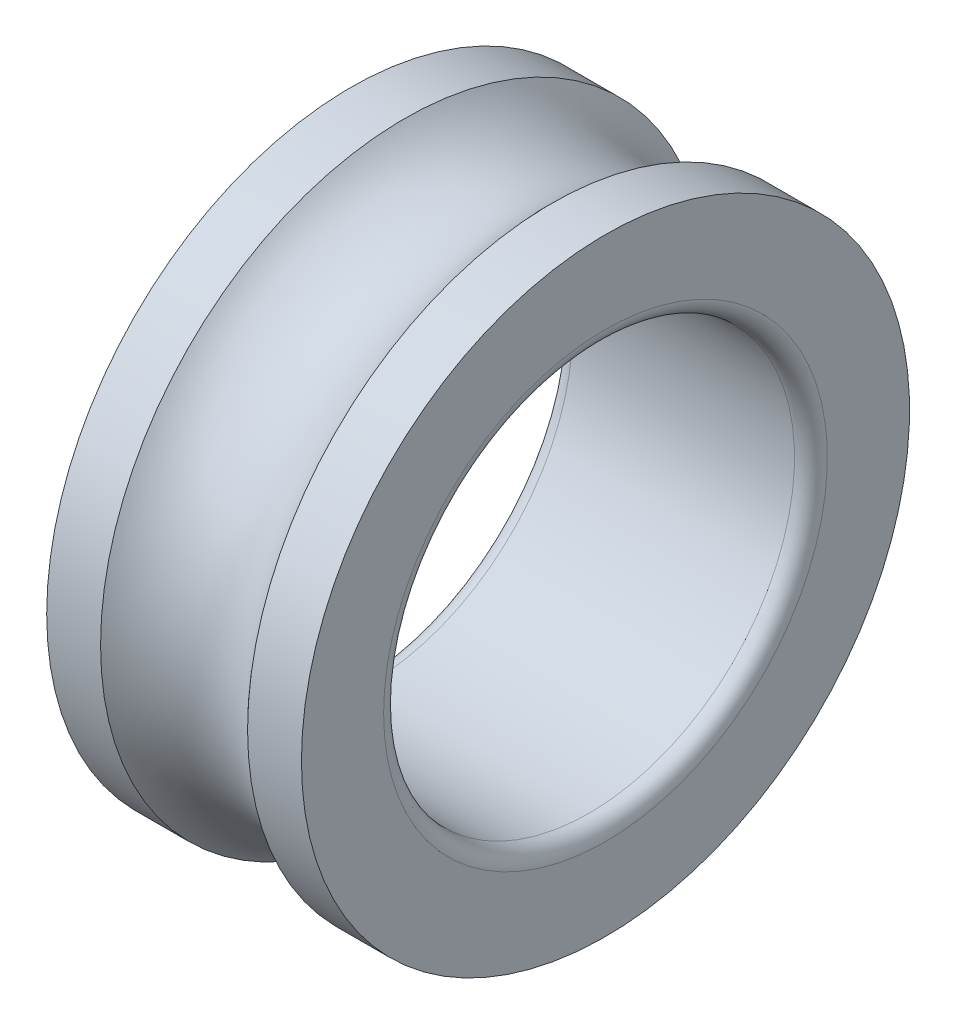
ISO-10303-21;
HEADER;
FILE_DESCRIPTION(('STEP AP214'),'2;1');
FILE_NAME('part.step','',(''),(''),'','','');
FILE_SCHEMA(('AUTOMOTIVE_DESIGN { 1 0 10303 214 1 1 1 1 }'));
ENDSEC;
DATA;
#1=APPLICATION_CONTEXT('core data for automotive mechanical design processes');
#2=APPLICATION_PROTOCOL_DEFINITION('international standard','automotive_design',2000,#1);
#3=PRODUCT_CONTEXT('',#1,'mechanical');
#4=PRODUCT('Part','Part','',(#3));
#5=PRODUCT_RELATED_PRODUCT_CATEGORY('part','',(#4));
#6=PRODUCT_DEFINITION_FORMATION('','',#4);
#7=PRODUCT_DEFINITION_CONTEXT('part definition',#1,'design');
#8=PRODUCT_DEFINITION('design','',#6,#7);
#9=PRODUCT_DEFINITION_SHAPE('','',#8);
#10=(LENGTH_UNIT() NAMED_UNIT(*) SI_UNIT(.MILLI.,.METRE.));
#11=(NAMED_UNIT(*) PLANE_ANGLE_UNIT() SI_UNIT($,.RADIAN.));
#12=(NAMED_UNIT(*) SI_UNIT($,.STERADIAN.) SOLID_ANGLE_UNIT());
#13=UNCERTAINTY_MEASURE_WITH_UNIT(LENGTH_MEASURE(1.E-05),#10,'distance_accuracy_value','');
#14=(GEOMETRIC_REPRESENTATION_CONTEXT(3) GLOBAL_UNCERTAINTY_ASSIGNED_CONTEXT((#13)) GLOBAL_UNIT_ASSIGNED_CONTEXT((#10,
#11,#12)) REPRESENTATION_CONTEXT('',''));
#15=CARTESIAN_POINT('',(0.,0.,0.));
#16=DIRECTION('',(0.,0.,1.));
#17=DIRECTION('',(1.,0.,0.));
#18=AXIS2_PLACEMENT_3D('',#15,#16,#17);
#19=CARTESIAN_POINT('',(15.5,37.,0.));
#20=DIRECTION('',(-1.,0.,0.));
#21=DIRECTION('',(0.,0.,1.));
#22=AXIS2_PLACEMENT_3D('',#19,#20,#21);
#23=PLANE('',#22);
#24=CARTESIAN_POINT('',(15.5,0.,0.));
#25=DIRECTION('',(-1.,0.,0.));
#26=DIRECTION('',(0.,0.,1.));
#27=AXIS2_PLACEMENT_3D('',#24,#25,#26);
#28=CIRCLE('',#27,27.);
#29=CARTESIAN_POINT('',(15.5,0.,27.));
#30=VERTEX_POINT('',#29);
#31=EDGE_CURVE('E10',#30,#30,#28,.T.);
#32=ORIENTED_EDGE('',*,*,#31,.T.);
#33=EDGE_LOOP('',(#32));
#34=FACE_BOUND('',#33,.T.);
#35=CARTESIAN_POINT('',(15.5,0.,0.));
#36=DIRECTION('',(-1.,0.,0.));
#37=DIRECTION('',(0.,0.,1.));
#38=AXIS2_PLACEMENT_3D('',#35,#36,#37);
#39=CIRCLE('',#38,37.);
#40=CARTESIAN_POINT('',(15.5,0.,37.));
#41=VERTEX_POINT('',#40);
#42=EDGE_CURVE('E61',#41,#41,#39,.T.);
#43=ORIENTED_EDGE('',*,*,#42,.F.);
#44=EDGE_LOOP('',(#43));
#45=FACE_BOUND('',#44,.T.);
#46=ADVANCED_FACE('F37',(#34,#45),#23,.F.);
#47=CARTESIAN_POINT('',(0.,0.,0.));
#48=DIRECTION('',(-1.,0.,0.));
#49=DIRECTION('',(0.,0.,1.));
#50=AXIS2_PLACEMENT_3D('',#47,#48,#49);
#51=CYLINDRICAL_SURFACE('',#50,37.);
#52=CARTESIAN_POINT('',(8.94427190999915,0.,0.));
#53=DIRECTION('',(-1.,0.,0.));
#54=DIRECTION('',(0.,0.,1.));
#55=AXIS2_PLACEMENT_3D('',#52,#53,#54);
#56=CIRCLE('',#55,37.);
#57=CARTESIAN_POINT('',(8.94427190999915,0.,37.));
#58=VERTEX_POINT('',#57);
#59=EDGE_CURVE('E65',#58,#58,#56,.T.);
#60=ORIENTED_EDGE('',*,*,#59,.F.);
#61=EDGE_LOOP('',(#60));
#62=FACE_BOUND('',#61,.T.);
#63=ORIENTED_EDGE('',*,*,#42,.T.);
#64=EDGE_LOOP('',(#63));
#65=FACE_BOUND('',#64,.T.);
#66=ADVANCED_FACE('F89',(#62,#65),#51,.T.);
#67=CARTESIAN_POINT('',(0.,0.,0.));
#68=DIRECTION('',(-1.,0.,0.));
#69=DIRECTION('',(0.,0.,1.));
#70=AXIS2_PLACEMENT_3D('',#67,#68,#69);
#71=TOROIDAL_SURFACE('',#70,45.,12.);
#72=CARTESIAN_POINT('',(-8.94427190999915,0.,0.));
#73=DIRECTION('',(-1.,0.,0.));
#74=DIRECTION('',(0.,0.,1.));
#75=AXIS2_PLACEMENT_3D('',#72,#73,#74);
#76=CIRCLE('',#75,37.);
#77=CARTESIAN_POINT('',(-8.94427190999915,0.,37.));
#78=VERTEX_POINT('',#77);
#79=EDGE_CURVE('E69',#78,#78,#76,.T.);
#80=ORIENTED_EDGE('',*,*,#79,.F.);
#81=EDGE_LOOP('',(#80));
#82=FACE_BOUND('',#81,.T.);
#83=ORIENTED_EDGE('',*,*,#59,.T.);
#84=EDGE_LOOP('',(#83));
#85=FACE_BOUND('',#84,.T.);
#86=ADVANCED_FACE('F83',(#82,#85),#71,.F.);
#87=CARTESIAN_POINT('',(0.,0.,0.));
#88=DIRECTION('',(-1.,0.,0.));
#89=DIRECTION('',(0.,0.,1.));
#90=AXIS2_PLACEMENT_3D('',#87,#88,#89);
#91=CYLINDRICAL_SURFACE('',#90,37.);
#92=CARTESIAN_POINT('',(-15.5,0.,0.));
#93=DIRECTION('',(-1.,0.,0.));
#94=DIRECTION('',(0.,0.,1.));
#95=AXIS2_PLACEMENT_3D('',#92,#93,#94);
#96=CIRCLE('',#95,37.);
#97=CARTESIAN_POINT('',(-15.5,0.,37.));
#98=VERTEX_POINT('',#97);
#99=EDGE_CURVE('E73',#98,#98,#96,.T.);
#100=ORIENTED_EDGE('',*,*,#99,.F.);
#101=EDGE_LOOP('',(#100));
#102=FACE_BOUND('',#101,.T.);
#103=ORIENTED_EDGE('',*,*,#79,.T.);
#104=EDGE_LOOP('',(#103));
#105=FACE_BOUND('',#104,.T.);
#106=ADVANCED_FACE('F80',(#102,#105),#91,.T.);
#107=CARTESIAN_POINT('',(-15.5,37.,0.));
#108=DIRECTION('',(1.,0.,0.));
#109=DIRECTION('',(0.,0.,-1.));
#110=AXIS2_PLACEMENT_3D('',#107,#108,#109);
#111=PLANE('',#110);
#112=CARTESIAN_POINT('',(-15.5,0.,0.));
#113=DIRECTION('',(1.,0.,0.));
#114=DIRECTION('',(0.,0.,-1.));
#115=AXIS2_PLACEMENT_3D('',#112,#113,#114);
#116=CIRCLE('',#115,27.);
#117=CARTESIAN_POINT('',(-15.5,0.,-27.));
#118=VERTEX_POINT('',#117);
#119=EDGE_CURVE('E45',#118,#118,#116,.T.);
#120=ORIENTED_EDGE('',*,*,#119,.T.);
#121=EDGE_LOOP('',(#120));
#122=FACE_BOUND('',#121,.T.);
#123=ORIENTED_EDGE('',*,*,#99,.T.);
#124=EDGE_LOOP('',(#123));
#125=FACE_BOUND('',#124,.T.);
#126=ADVANCED_FACE('F78',(#122,#125),#111,.F.);
#127=CARTESIAN_POINT('',(0.,0.,0.));
#128=DIRECTION('',(-1.,0.,0.));
#129=DIRECTION('',(0.,0.,1.));
#130=AXIS2_PLACEMENT_3D('',#127,#128,#129);
#131=CYLINDRICAL_SURFACE('',#130,25.);
#132=CARTESIAN_POINT('',(-13.5,0.,0.));
#133=DIRECTION('',(1.,0.,0.));
#134=DIRECTION('',(0.,0.,-1.));
#135=AXIS2_PLACEMENT_3D('',#132,#133,#134);
#136=CIRCLE('',#135,25.);
#137=CARTESIAN_POINT('',(-13.5,0.,-25.));
#138=VERTEX_POINT('',#137);
#139=EDGE_CURVE('E50',#138,#138,#136,.F.);
#140=ORIENTED_EDGE('',*,*,#139,.T.);
#141=EDGE_LOOP('',(#140));
#142=FACE_BOUND('',#141,.T.);
#143=CARTESIAN_POINT('',(13.5,0.,0.));
#144=DIRECTION('',(-1.,0.,0.));
#145=DIRECTION('',(0.,0.,1.));
#146=AXIS2_PLACEMENT_3D('',#143,#144,#145);
#147=CIRCLE('',#146,25.);
#148=CARTESIAN_POINT('',(13.5,0.,25.));
#149=VERTEX_POINT('',#148);
#150=EDGE_CURVE('E55',#149,#149,#147,.F.);
#151=ORIENTED_EDGE('',*,*,#150,.T.);
#152=EDGE_LOOP('',(#151));
#153=FACE_BOUND('',#152,.T.);
#154=ADVANCED_FACE('F104',(#142,#153),#131,.F.);
#155=CARTESIAN_POINT('',(-13.5,0.,0.));
#156=DIRECTION('',(1.,0.,0.));
#157=DIRECTION('',(0.,0.,-1.));
#158=AXIS2_PLACEMENT_3D('',#155,#156,#157);
#159=TOROIDAL_SURFACE('',#158,27.,2.);
#160=ORIENTED_EDGE('',*,*,#119,.F.);
#161=EDGE_LOOP('',(#160));
#162=FACE_BOUND('',#161,.T.);
#163=ORIENTED_EDGE('',*,*,#139,.F.);
#164=EDGE_LOOP('',(#163));
#165=FACE_BOUND('',#164,.T.);
#166=ADVANCED_FACE('F102',(#162,#165),#159,.T.);
#167=CARTESIAN_POINT('',(13.5,0.,0.));
#168=DIRECTION('',(-1.,0.,0.));
#169=DIRECTION('',(0.,0.,1.));
#170=AXIS2_PLACEMENT_3D('',#167,#168,#169);
#171=TOROIDAL_SURFACE('',#170,27.,2.);
#172=ORIENTED_EDGE('',*,*,#150,.F.);
#173=EDGE_LOOP('',(#172));
#174=FACE_BOUND('',#173,.T.);
#175=ORIENTED_EDGE('',*,*,#31,.F.);
#176=EDGE_LOOP('',(#175));
#177=FACE_BOUND('',#176,.T.);
#178=ADVANCED_FACE('F39',(#174,#177),#171,.T.);
#179=CLOSED_SHELL('',(#46,#66,#86,#106,#126,#154,#166,#178));
#180=MANIFOLD_SOLID_BREP('B2',#179);
#181=ADVANCED_BREP_SHAPE_REPRESENTATION('',(#18,#180),#14);
#182=SHAPE_DEFINITION_REPRESENTATION(#9,#181);
ENDSEC;
END-ISO-10303-21;
